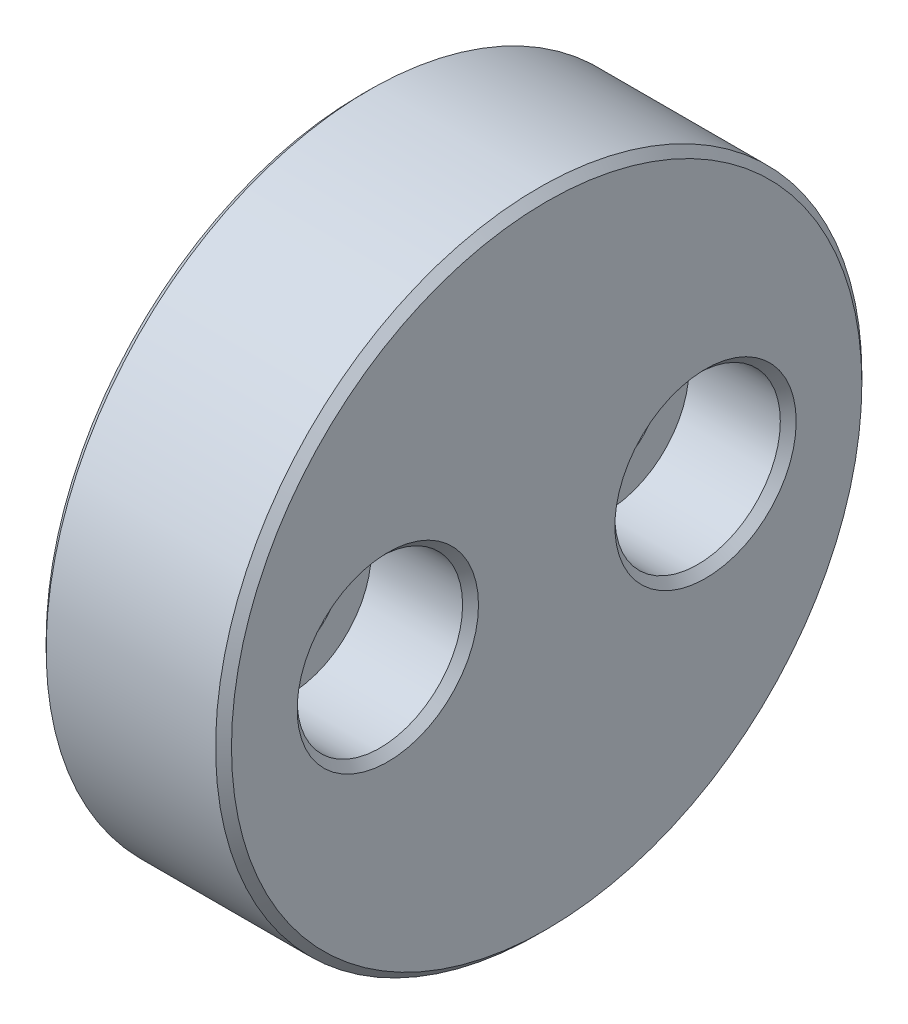
ISO-10303-21;
HEADER;
FILE_DESCRIPTION(('STEP AP214'),'2;1');
FILE_NAME('part.step','',(''),(''),'','','');
FILE_SCHEMA(('AUTOMOTIVE_DESIGN { 1 0 10303 214 1 1 1 1 }'));
ENDSEC;
DATA;
#1=APPLICATION_CONTEXT('core data for automotive mechanical design processes');
#2=APPLICATION_PROTOCOL_DEFINITION('international standard','automotive_design',2000,#1);
#3=PRODUCT_CONTEXT('',#1,'mechanical');
#4=PRODUCT('Part','Part','',(#3));
#5=PRODUCT_RELATED_PRODUCT_CATEGORY('part','',(#4));
#6=PRODUCT_DEFINITION_FORMATION('','',#4);
#7=PRODUCT_DEFINITION_CONTEXT('part definition',#1,'design');
#8=PRODUCT_DEFINITION('design','',#6,#7);
#9=PRODUCT_DEFINITION_SHAPE('','',#8);
#10=(LENGTH_UNIT() NAMED_UNIT(*) SI_UNIT(.MILLI.,.METRE.));
#11=(NAMED_UNIT(*) PLANE_ANGLE_UNIT() SI_UNIT($,.RADIAN.));
#12=(NAMED_UNIT(*) SI_UNIT($,.STERADIAN.) SOLID_ANGLE_UNIT());
#13=UNCERTAINTY_MEASURE_WITH_UNIT(LENGTH_MEASURE(1.E-05),#10,'distance_accuracy_value','');
#14=(GEOMETRIC_REPRESENTATION_CONTEXT(3) GLOBAL_UNCERTAINTY_ASSIGNED_CONTEXT((#13)) GLOBAL_UNIT_ASSIGNED_CONTEXT((#10,
#11,#12)) REPRESENTATION_CONTEXT('',''));
#15=CARTESIAN_POINT('',(0.,0.,0.));
#16=DIRECTION('',(0.,0.,1.));
#17=DIRECTION('',(1.,0.,0.));
#18=AXIS2_PLACEMENT_3D('',#15,#16,#17);
#19=CARTESIAN_POINT('',(17.78,0.,0.));
#20=DIRECTION('',(-1.,0.,0.));
#21=DIRECTION('',(0.,0.,1.));
#22=AXIS2_PLACEMENT_3D('',#19,#20,#21);
#23=CYLINDRICAL_SURFACE('',#22,31.);
#24=CARTESIAN_POINT('',(0.762000000000002,0.,0.));
#25=DIRECTION('',(1.,0.,0.));
#26=DIRECTION('',(0.,0.,-1.));
#27=AXIS2_PLACEMENT_3D('',#24,#25,#26);
#28=CIRCLE('',#27,31.);
#29=CARTESIAN_POINT('',(0.762000000000002,0.,-31.));
#30=VERTEX_POINT('',#29);
#31=EDGE_CURVE('E57',#30,#30,#28,.T.);
#32=ORIENTED_EDGE('',*,*,#31,.T.);
#33=EDGE_LOOP('',(#32));
#34=FACE_BOUND('',#33,.T.);
#35=CARTESIAN_POINT('',(17.018,0.,0.));
#36=DIRECTION('',(1.,0.,0.));
#37=DIRECTION('',(0.,0.,-1.));
#38=AXIS2_PLACEMENT_3D('',#35,#36,#37);
#39=CIRCLE('',#38,31.);
#40=CARTESIAN_POINT('',(17.018,0.,-31.));
#41=VERTEX_POINT('',#40);
#42=EDGE_CURVE('E60',#41,#41,#39,.F.);
#43=ORIENTED_EDGE('',*,*,#42,.T.);
#44=EDGE_LOOP('',(#43));
#45=FACE_BOUND('',#44,.T.);
#46=ADVANCED_FACE('F31',(#34,#45),#23,.T.);
#47=CARTESIAN_POINT('',(17.78,0.,0.));
#48=DIRECTION('',(1.,0.,0.));
#49=DIRECTION('',(0.,0.,-1.));
#50=AXIS2_PLACEMENT_3D('',#47,#48,#49);
#51=PLANE('',#50);
#52=CARTESIAN_POINT('',(17.78,0.,-15.24));
#53=DIRECTION('',(1.,0.,0.));
#54=DIRECTION('',(0.,0.,-1.));
#55=AXIS2_PLACEMENT_3D('',#52,#53,#54);
#56=CIRCLE('',#55,8.6995);
#57=CARTESIAN_POINT('',(17.78,0.,-23.9395));
#58=VERTEX_POINT('',#57);
#59=EDGE_CURVE('E38',#58,#58,#56,.F.);
#60=ORIENTED_EDGE('',*,*,#59,.T.);
#61=EDGE_LOOP('',(#60));
#62=FACE_BOUND('',#61,.T.);
#63=CARTESIAN_POINT('',(17.78,0.,15.24));
#64=DIRECTION('',(1.,0.,0.));
#65=DIRECTION('',(0.,0.,-1.));
#66=AXIS2_PLACEMENT_3D('',#63,#64,#65);
#67=CIRCLE('',#66,8.6995);
#68=CARTESIAN_POINT('',(17.78,0.,6.5405));
#69=VERTEX_POINT('',#68);
#70=EDGE_CURVE('E42',#69,#69,#67,.F.);
#71=ORIENTED_EDGE('',*,*,#70,.T.);
#72=EDGE_LOOP('',(#71));
#73=FACE_BOUND('',#72,.T.);
#74=CARTESIAN_POINT('',(17.78,0.,0.));
#75=DIRECTION('',(1.,0.,0.));
#76=DIRECTION('',(0.,0.,-1.));
#77=AXIS2_PLACEMENT_3D('',#74,#75,#76);
#78=CIRCLE('',#77,30.238);
#79=CARTESIAN_POINT('',(17.78,0.,-30.238));
#80=VERTEX_POINT('',#79);
#81=EDGE_CURVE('E46',#80,#80,#78,.T.);
#82=ORIENTED_EDGE('',*,*,#81,.T.);
#83=EDGE_LOOP('',(#82));
#84=FACE_BOUND('',#83,.T.);
#85=ADVANCED_FACE('F99',(#62,#73,#84),#51,.T.);
#86=CARTESIAN_POINT('',(0.,0.,0.));
#87=DIRECTION('',(1.,0.,0.));
#88=DIRECTION('',(0.,0.,-1.));
#89=AXIS2_PLACEMENT_3D('',#86,#87,#88);
#90=PLANE('',#89);
#91=CARTESIAN_POINT('',(0.,0.,0.));
#92=DIRECTION('',(1.,0.,0.));
#93=DIRECTION('',(0.,0.,-1.));
#94=AXIS2_PLACEMENT_3D('',#91,#92,#93);
#95=CIRCLE('',#94,30.238);
#96=CARTESIAN_POINT('',(0.,0.,-30.238));
#97=VERTEX_POINT('',#96);
#98=EDGE_CURVE('E54',#97,#97,#95,.F.);
#99=ORIENTED_EDGE('',*,*,#98,.T.);
#100=EDGE_LOOP('',(#99));
#101=FACE_BOUND('',#100,.T.);
#102=CARTESIAN_POINT('',(0.,0.,15.24));
#103=DIRECTION('',(1.,0.,0.));
#104=DIRECTION('',(0.,0.,-1.));
#105=AXIS2_PLACEMENT_3D('',#102,#103,#104);
#106=CIRCLE('',#105,4.90219999999999);
#107=CARTESIAN_POINT('',(0.,0.,10.3378));
#108=VERTEX_POINT('',#107);
#109=EDGE_CURVE('E64',#108,#108,#106,.T.);
#110=ORIENTED_EDGE('',*,*,#109,.T.);
#111=EDGE_LOOP('',(#110));
#112=FACE_BOUND('',#111,.T.);
#113=CARTESIAN_POINT('',(0.,0.,-15.24));
#114=DIRECTION('',(1.,0.,0.));
#115=DIRECTION('',(0.,0.,-1.));
#116=AXIS2_PLACEMENT_3D('',#113,#114,#115);
#117=CIRCLE('',#116,4.90219999999999);
#118=CARTESIAN_POINT('',(0.,0.,-20.1422));
#119=VERTEX_POINT('',#118);
#120=EDGE_CURVE('E63',#119,#119,#117,.T.);
#121=ORIENTED_EDGE('',*,*,#120,.T.);
#122=EDGE_LOOP('',(#121));
#123=FACE_BOUND('',#122,.T.);
#124=ADVANCED_FACE('F105',(#101,#112,#123),#90,.F.);
#125=CARTESIAN_POINT('',(17.78,0.,-15.24));
#126=DIRECTION('',(1.,0.,0.));
#127=DIRECTION('',(0.,0.,-1.));
#128=AXIS2_PLACEMENT_3D('',#125,#126,#127);
#129=CYLINDRICAL_SURFACE('',#128,4.90219999999999);
#130=CARTESIAN_POINT('',(8.255,0.,-15.24));
#131=DIRECTION('',(1.,0.,0.));
#132=DIRECTION('',(0.,0.,-1.));
#133=AXIS2_PLACEMENT_3D('',#130,#131,#132);
#134=CIRCLE('',#133,4.9022);
#135=CARTESIAN_POINT('',(8.255,0.,-20.1422));
#136=VERTEX_POINT('',#135);
#137=EDGE_CURVE('E71',#136,#136,#134,.T.);
#138=ORIENTED_EDGE('',*,*,#137,.T.);
#139=EDGE_LOOP('',(#138));
#140=FACE_BOUND('',#139,.T.);
#141=ORIENTED_EDGE('',*,*,#120,.F.);
#142=EDGE_LOOP('',(#141));
#143=FACE_BOUND('',#142,.T.);
#144=ADVANCED_FACE('F173',(#140,#143),#129,.F.);
#145=CARTESIAN_POINT('',(8.255,4.9022,-15.24));
#146=DIRECTION('',(-1.,0.,0.));
#147=DIRECTION('',(0.,0.,1.));
#148=AXIS2_PLACEMENT_3D('',#145,#146,#147);
#149=PLANE('',#148);
#150=ORIENTED_EDGE('',*,*,#137,.F.);
#151=EDGE_LOOP('',(#150));
#152=FACE_BOUND('',#151,.T.);
#153=CARTESIAN_POINT('',(8.255,0.,-15.24));
#154=DIRECTION('',(1.,0.,0.));
#155=DIRECTION('',(0.,0.,-1.));
#156=AXIS2_PLACEMENT_3D('',#153,#154,#155);
#157=CIRCLE('',#156,7.9375);
#158=CARTESIAN_POINT('',(8.255,0.,-23.1775));
#159=VERTEX_POINT('',#158);
#160=EDGE_CURVE('E67',#159,#159,#157,.T.);
#161=ORIENTED_EDGE('',*,*,#160,.T.);
#162=EDGE_LOOP('',(#161));
#163=FACE_BOUND('',#162,.T.);
#164=ADVANCED_FACE('F159',(#152,#163),#149,.F.);
#165=CARTESIAN_POINT('',(17.78,0.,-15.24));
#166=DIRECTION('',(1.,0.,0.));
#167=DIRECTION('',(0.,0.,-1.));
#168=AXIS2_PLACEMENT_3D('',#165,#166,#167);
#169=CYLINDRICAL_SURFACE('',#168,7.9375);
#170=CARTESIAN_POINT('',(17.018,0.,-15.24));
#171=DIRECTION('',(1.,0.,0.));
#172=DIRECTION('',(0.,0.,-1.));
#173=AXIS2_PLACEMENT_3D('',#170,#171,#172);
#174=CIRCLE('',#173,7.9375);
#175=CARTESIAN_POINT('',(17.018,0.,-23.1775));
#176=VERTEX_POINT('',#175);
#177=EDGE_CURVE('E51',#176,#176,#174,.T.);
#178=ORIENTED_EDGE('',*,*,#177,.T.);
#179=EDGE_LOOP('',(#178));
#180=FACE_BOUND('',#179,.T.);
#181=ORIENTED_EDGE('',*,*,#160,.F.);
#182=EDGE_LOOP('',(#181));
#183=FACE_BOUND('',#182,.T.);
#184=ADVANCED_FACE('F154',(#180,#183),#169,.F.);
#185=CARTESIAN_POINT('',(17.78,0.,15.24));
#186=DIRECTION('',(1.,0.,0.));
#187=DIRECTION('',(0.,0.,-1.));
#188=AXIS2_PLACEMENT_3D('',#185,#186,#187);
#189=CYLINDRICAL_SURFACE('',#188,4.90219999999999);
#190=CARTESIAN_POINT('',(8.255,0.,15.24));
#191=DIRECTION('',(1.,0.,0.));
#192=DIRECTION('',(0.,0.,-1.));
#193=AXIS2_PLACEMENT_3D('',#190,#191,#192);
#194=CIRCLE('',#193,4.9022);
#195=CARTESIAN_POINT('',(8.255,0.,10.3378));
#196=VERTEX_POINT('',#195);
#197=EDGE_CURVE('E68',#196,#196,#194,.T.);
#198=ORIENTED_EDGE('',*,*,#197,.T.);
#199=EDGE_LOOP('',(#198));
#200=FACE_BOUND('',#199,.T.);
#201=ORIENTED_EDGE('',*,*,#109,.F.);
#202=EDGE_LOOP('',(#201));
#203=FACE_BOUND('',#202,.T.);
#204=ADVANCED_FACE('F95',(#200,#203),#189,.F.);
#205=CARTESIAN_POINT('',(8.255,4.9022,15.24));
#206=DIRECTION('',(-1.,0.,0.));
#207=DIRECTION('',(0.,0.,1.));
#208=AXIS2_PLACEMENT_3D('',#205,#206,#207);
#209=PLANE('',#208);
#210=ORIENTED_EDGE('',*,*,#197,.F.);
#211=EDGE_LOOP('',(#210));
#212=FACE_BOUND('',#211,.T.);
#213=CARTESIAN_POINT('',(8.255,0.,15.24));
#214=DIRECTION('',(1.,0.,0.));
#215=DIRECTION('',(0.,0.,-1.));
#216=AXIS2_PLACEMENT_3D('',#213,#214,#215);
#217=CIRCLE('',#216,7.9375);
#218=CARTESIAN_POINT('',(8.255,0.,7.3025));
#219=VERTEX_POINT('',#218);
#220=EDGE_CURVE('E78',#219,#219,#217,.T.);
#221=ORIENTED_EDGE('',*,*,#220,.T.);
#222=EDGE_LOOP('',(#221));
#223=FACE_BOUND('',#222,.T.);
#224=ADVANCED_FACE('F82',(#212,#223),#209,.F.);
#225=CARTESIAN_POINT('',(17.78,0.,15.24));
#226=DIRECTION('',(1.,0.,0.));
#227=DIRECTION('',(0.,0.,-1.));
#228=AXIS2_PLACEMENT_3D('',#225,#226,#227);
#229=CYLINDRICAL_SURFACE('',#228,7.9375);
#230=CARTESIAN_POINT('',(17.018,0.,15.24));
#231=DIRECTION('',(1.,0.,0.));
#232=DIRECTION('',(0.,0.,-1.));
#233=AXIS2_PLACEMENT_3D('',#230,#231,#232);
#234=CIRCLE('',#233,7.9375);
#235=CARTESIAN_POINT('',(17.018,0.,7.3025));
#236=VERTEX_POINT('',#235);
#237=EDGE_CURVE('E10',#236,#236,#234,.T.);
#238=ORIENTED_EDGE('',*,*,#237,.T.);
#239=EDGE_LOOP('',(#238));
#240=FACE_BOUND('',#239,.T.);
#241=ORIENTED_EDGE('',*,*,#220,.F.);
#242=EDGE_LOOP('',(#241));
#243=FACE_BOUND('',#242,.T.);
#244=ADVANCED_FACE('F84',(#240,#243),#229,.F.);
#245=CARTESIAN_POINT('',(0.762000000000002,0.,0.));
#246=DIRECTION('',(1.,0.,0.));
#247=DIRECTION('',(0.,0.,-1.));
#248=AXIS2_PLACEMENT_3D('',#245,#246,#247);
#249=CONICAL_SURFACE('',#248,31.,0.785398163397451);
#250=ORIENTED_EDGE('',*,*,#98,.F.);
#251=EDGE_LOOP('',(#250));
#252=FACE_BOUND('',#251,.T.);
#253=ORIENTED_EDGE('',*,*,#31,.F.);
#254=EDGE_LOOP('',(#253));
#255=FACE_BOUND('',#254,.T.);
#256=ADVANCED_FACE('F86',(#252,#255),#249,.T.);
#257=CARTESIAN_POINT('',(17.018,0.,-15.24));
#258=DIRECTION('',(1.,0.,0.));
#259=DIRECTION('',(0.,0.,-1.));
#260=AXIS2_PLACEMENT_3D('',#257,#258,#259);
#261=CONICAL_SURFACE('',#260,7.9375,0.785398163397455);
#262=CARTESIAN_POINT('',(17.78,0.,-23.9395));
#263=CARTESIAN_POINT('',(17.7720625,0.,-23.9315625));
#264=CARTESIAN_POINT('',(17.764125,0.,-23.923625));
#265=CARTESIAN_POINT('',(17.74825,0.,-23.90775));
#266=CARTESIAN_POINT('',(17.7403125,0.,-23.8998125));
#267=CARTESIAN_POINT('',(17.7244375,0.,-23.8839375));
#268=CARTESIAN_POINT('',(17.7165,0.,-23.876));
#269=CARTESIAN_POINT('',(17.700625,0.,-23.860125));
#270=CARTESIAN_POINT('',(17.6926875,0.,-23.8521875));
#271=CARTESIAN_POINT('',(17.6768125,0.,-23.8363125));
#272=CARTESIAN_POINT('',(17.668875,0.,-23.828375));
#273=CARTESIAN_POINT('',(17.653,0.,-23.8125));
#274=CARTESIAN_POINT('',(17.6450625,0.,-23.8045625));
#275=CARTESIAN_POINT('',(17.6291875,0.,-23.7886875));
#276=CARTESIAN_POINT('',(17.62125,0.,-23.78075));
#277=CARTESIAN_POINT('',(17.605375,0.,-23.764875));
#278=CARTESIAN_POINT('',(17.5974375,0.,-23.7569375));
#279=CARTESIAN_POINT('',(17.5815625,0.,-23.7410625));
#280=CARTESIAN_POINT('',(17.573625,0.,-23.733125));
#281=CARTESIAN_POINT('',(17.55775,0.,-23.71725));
#282=CARTESIAN_POINT('',(17.5498125,0.,-23.7093125));
#283=CARTESIAN_POINT('',(17.5339375,0.,-23.6934375));
#284=CARTESIAN_POINT('',(17.526,0.,-23.6855));
#285=CARTESIAN_POINT('',(17.510125,0.,-23.669625));
#286=CARTESIAN_POINT('',(17.5021875,0.,-23.6616875));
#287=CARTESIAN_POINT('',(17.4863125,0.,-23.6458125));
#288=CARTESIAN_POINT('',(17.478375,0.,-23.637875));
#289=CARTESIAN_POINT('',(17.4625,0.,-23.622));
#290=CARTESIAN_POINT('',(17.4545625,0.,-23.6140625));
#291=CARTESIAN_POINT('',(17.4386875,0.,-23.5981875));
#292=CARTESIAN_POINT('',(17.43075,0.,-23.59025));
#293=CARTESIAN_POINT('',(17.414875,0.,-23.574375));
#294=CARTESIAN_POINT('',(17.4069375,0.,-23.5664375));
#295=CARTESIAN_POINT('',(17.3910625,0.,-23.5505625));
#296=CARTESIAN_POINT('',(17.383125,0.,-23.542625));
#297=CARTESIAN_POINT('',(17.36725,0.,-23.52675));
#298=CARTESIAN_POINT('',(17.3593125,0.,-23.5188125));
#299=CARTESIAN_POINT('',(17.3434375,0.,-23.5029375));
#300=CARTESIAN_POINT('',(17.3355,0.,-23.495));
#301=CARTESIAN_POINT('',(17.319625,0.,-23.479125));
#302=CARTESIAN_POINT('',(17.3116875,0.,-23.4711875));
#303=CARTESIAN_POINT('',(17.2958125,0.,-23.4553125));
#304=CARTESIAN_POINT('',(17.287875,0.,-23.447375));
#305=CARTESIAN_POINT('',(17.272,0.,-23.4315));
#306=CARTESIAN_POINT('',(17.2640625,0.,-23.4235625));
#307=CARTESIAN_POINT('',(17.2481875,0.,-23.4076875));
#308=CARTESIAN_POINT('',(17.24025,0.,-23.39975));
#309=CARTESIAN_POINT('',(17.224375,0.,-23.383875));
#310=CARTESIAN_POINT('',(17.2164375,0.,-23.3759375));
#311=CARTESIAN_POINT('',(17.2005625,0.,-23.3600625));
#312=CARTESIAN_POINT('',(17.192625,0.,-23.352125));
#313=CARTESIAN_POINT('',(17.17675,0.,-23.33625));
#314=CARTESIAN_POINT('',(17.1688125,0.,-23.3283125));
#315=CARTESIAN_POINT('',(17.1529375,0.,-23.3124375));
#316=CARTESIAN_POINT('',(17.145,0.,-23.3045));
#317=CARTESIAN_POINT('',(17.129125,0.,-23.288625));
#318=CARTESIAN_POINT('',(17.1211875,0.,-23.2806875));
#319=CARTESIAN_POINT('',(17.1053125,0.,-23.2648125));
#320=CARTESIAN_POINT('',(17.097375,0.,-23.256875));
#321=CARTESIAN_POINT('',(17.0815,0.,-23.241));
#322=CARTESIAN_POINT('',(17.0735625,0.,-23.2330625));
#323=CARTESIAN_POINT('',(17.0576875,0.,-23.2171875));
#324=CARTESIAN_POINT('',(17.04975,0.,-23.20925));
#325=CARTESIAN_POINT('',(17.033875,0.,-23.193375));
#326=CARTESIAN_POINT('',(17.0259375,0.,-23.1854375));
#327=CARTESIAN_POINT('',(17.018,0.,-23.1775));
#328=B_SPLINE_CURVE_WITH_KNOTS('',3,(#262,#263,#264,#265,#266,#267,#268,#269,#270,#271,#272,
#273,#274,#275,#276,#277,#278,#279,#280,#281,#282,#283,#284,#285,#286,#287,#288,#289,#290,#291,
#292,#293,#294,#295,#296,#297,#298,#299,#300,#301,#302,#303,#304,#305,#306,#307,#308,#309,#310,
#311,#312,#313,#314,#315,#316,#317,#318,#319,#320,#321,#322,#323,#324,#325,#326,#327),
.UNSPECIFIED.,.F.,.F.,(4,2,2,2,2,2,2,2,2,2,2,2,2,2,2,2,2,2,2,2,2,2,2,2,2,2,2,2,2,2,2,2,4),(0.,
0.0336759604540062,0.0673519209080173,0.101027881362026,0.134703841816035,0.168379802270043,
0.202055762724054,0.235731723178061,0.269407683632072,0.30308364408608,0.336759604540089,
0.370435564994098,0.404111525448109,0.437787485902115,0.471463446356124,0.505139406810135,
0.538815367264143,0.572491327718152,0.606167288172161,0.639843248626172,0.673519209080178,
0.707195169534189,0.740871129988198,0.774547090442206,0.808223050896215,0.841899011350226,
0.875574971804232,0.909250932258243,0.942926892712252,0.976602853166261,1.01027881362027,
1.04395477407428,1.07763073452829),.UNSPECIFIED.);
#329=EDGE_CURVE('BSEAM92',#58,#176,#328,.T.);
#330=ORIENTED_EDGE('',*,*,#59,.F.);
#331=ORIENTED_EDGE('',*,*,#177,.F.);
#332=ORIENTED_EDGE('',*,*,#329,.T.);
#333=ORIENTED_EDGE('',*,*,#329,.F.);
#334=EDGE_LOOP('',(#330,#332,#331,#333));
#335=FACE_BOUND('',#334,.T.);
#336=ADVANCED_FACE('F92',(#335),#261,.F.);
#337=CARTESIAN_POINT('',(17.018,0.,15.24));
#338=DIRECTION('',(1.,0.,0.));
#339=DIRECTION('',(0.,0.,-1.));
#340=AXIS2_PLACEMENT_3D('',#337,#338,#339);
#341=CONICAL_SURFACE('',#340,7.9375,0.785398163397454);
#342=CARTESIAN_POINT('',(17.78,0.,6.5405));
#343=CARTESIAN_POINT('',(17.7720625,0.,6.5484375));
#344=CARTESIAN_POINT('',(17.764125,0.,6.556375));
#345=CARTESIAN_POINT('',(17.74825,0.,6.57225));
#346=CARTESIAN_POINT('',(17.7403125,0.,6.5801875));
#347=CARTESIAN_POINT('',(17.7244375,0.,6.5960625));
#348=CARTESIAN_POINT('',(17.7165,0.,6.604));
#349=CARTESIAN_POINT('',(17.700625,0.,6.619875));
#350=CARTESIAN_POINT('',(17.6926875,0.,6.6278125));
#351=CARTESIAN_POINT('',(17.6768125,0.,6.6436875));
#352=CARTESIAN_POINT('',(17.668875,0.,6.651625));
#353=CARTESIAN_POINT('',(17.653,0.,6.6675));
#354=CARTESIAN_POINT('',(17.6450625,0.,6.6754375));
#355=CARTESIAN_POINT('',(17.6291875,0.,6.6913125));
#356=CARTESIAN_POINT('',(17.62125,0.,6.69925));
#357=CARTESIAN_POINT('',(17.605375,0.,6.715125));
#358=CARTESIAN_POINT('',(17.5974375,0.,6.7230625));
#359=CARTESIAN_POINT('',(17.5815625,0.,6.7389375));
#360=CARTESIAN_POINT('',(17.573625,0.,6.746875));
#361=CARTESIAN_POINT('',(17.55775,0.,6.76275));
#362=CARTESIAN_POINT('',(17.5498125,0.,6.7706875));
#363=CARTESIAN_POINT('',(17.5339375,0.,6.7865625));
#364=CARTESIAN_POINT('',(17.526,0.,6.7945));
#365=CARTESIAN_POINT('',(17.510125,0.,6.810375));
#366=CARTESIAN_POINT('',(17.5021875,0.,6.8183125));
#367=CARTESIAN_POINT('',(17.4863125,0.,6.8341875));
#368=CARTESIAN_POINT('',(17.478375,0.,6.842125));
#369=CARTESIAN_POINT('',(17.4625,0.,6.858));
#370=CARTESIAN_POINT('',(17.4545625,0.,6.8659375));
#371=CARTESIAN_POINT('',(17.4386875,0.,6.8818125));
#372=CARTESIAN_POINT('',(17.43075,0.,6.88975));
#373=CARTESIAN_POINT('',(17.414875,0.,6.905625));
#374=CARTESIAN_POINT('',(17.4069375,0.,6.9135625));
#375=CARTESIAN_POINT('',(17.3910625,0.,6.9294375));
#376=CARTESIAN_POINT('',(17.383125,0.,6.937375));
#377=CARTESIAN_POINT('',(17.36725,0.,6.95325));
#378=CARTESIAN_POINT('',(17.3593125,0.,6.9611875));
#379=CARTESIAN_POINT('',(17.3434375,0.,6.9770625));
#380=CARTESIAN_POINT('',(17.3355,0.,6.985));
#381=CARTESIAN_POINT('',(17.319625,0.,7.000875));
#382=CARTESIAN_POINT('',(17.3116875,0.,7.0088125));
#383=CARTESIAN_POINT('',(17.2958125,0.,7.0246875));
#384=CARTESIAN_POINT('',(17.287875,0.,7.032625));
#385=CARTESIAN_POINT('',(17.272,0.,7.0485));
#386=CARTESIAN_POINT('',(17.2640625,0.,7.0564375));
#387=CARTESIAN_POINT('',(17.2481875,0.,7.0723125));
#388=CARTESIAN_POINT('',(17.24025,0.,7.08025));
#389=CARTESIAN_POINT('',(17.224375,0.,7.096125));
#390=CARTESIAN_POINT('',(17.2164375,0.,7.1040625));
#391=CARTESIAN_POINT('',(17.2005625,0.,7.1199375));
#392=CARTESIAN_POINT('',(17.192625,0.,7.127875));
#393=CARTESIAN_POINT('',(17.17675,0.,7.14375));
#394=CARTESIAN_POINT('',(17.1688125,0.,7.1516875));
#395=CARTESIAN_POINT('',(17.1529375,0.,7.1675625));
#396=CARTESIAN_POINT('',(17.145,0.,7.1755));
#397=CARTESIAN_POINT('',(17.129125,0.,7.191375));
#398=CARTESIAN_POINT('',(17.1211875,0.,7.1993125));
#399=CARTESIAN_POINT('',(17.1053125,0.,7.2151875));
#400=CARTESIAN_POINT('',(17.097375,0.,7.223125));
#401=CARTESIAN_POINT('',(17.0815,0.,7.239));
#402=CARTESIAN_POINT('',(17.0735625,0.,7.2469375));
#403=CARTESIAN_POINT('',(17.0576875,0.,7.2628125));
#404=CARTESIAN_POINT('',(17.04975,0.,7.27075));
#405=CARTESIAN_POINT('',(17.033875,0.,7.286625));
#406=CARTESIAN_POINT('',(17.0259375,0.,7.2945625));
#407=CARTESIAN_POINT('',(17.018,0.,7.3025));
#408=B_SPLINE_CURVE_WITH_KNOTS('',3,(#342,#343,#344,#345,#346,#347,#348,#349,#350,#351,#352,
#353,#354,#355,#356,#357,#358,#359,#360,#361,#362,#363,#364,#365,#366,#367,#368,#369,#370,#371,
#372,#373,#374,#375,#376,#377,#378,#379,#380,#381,#382,#383,#384,#385,#386,#387,#388,#389,#390,
#391,#392,#393,#394,#395,#396,#397,#398,#399,#400,#401,#402,#403,#404,#405,#406,#407),
.UNSPECIFIED.,.F.,.F.,(4,2,2,2,2,2,2,2,2,2,2,2,2,2,2,2,2,2,2,2,2,2,2,2,2,2,2,2,2,2,2,2,4),(0.,
0.0336759604540074,0.0673519209080173,0.101027881362026,0.134703841816036,0.168379802270043,
0.202055762724053,0.235731723178062,0.269407683632072,0.303083644086079,0.336759604540089,
0.370435564994097,0.404111525448108,0.437787485902115,0.471463446356125,0.505139406810132,
0.538815367264143,0.572491327718153,0.606167288172161,0.639843248626171,0.673519209080178,
0.707195169534189,0.740871129988196,0.774547090442206,0.808223050896214,0.841899011350224,
0.875574971804232,0.909250932258242,0.94292689271225,0.976602853166259,1.01027881362027,
1.04395477407428,1.07763073452829),.UNSPECIFIED.);
#409=EDGE_CURVE('BSEAM111',#69,#236,#408,.T.);
#410=ORIENTED_EDGE('',*,*,#70,.F.);
#411=ORIENTED_EDGE('',*,*,#237,.F.);
#412=ORIENTED_EDGE('',*,*,#409,.T.);
#413=ORIENTED_EDGE('',*,*,#409,.F.);
#414=EDGE_LOOP('',(#410,#412,#411,#413));
#415=FACE_BOUND('',#414,.T.);
#416=ADVANCED_FACE('F111',(#415),#341,.F.);
#417=CARTESIAN_POINT('',(17.78,0.,0.));
#418=DIRECTION('',(-1.,0.,0.));
#419=DIRECTION('',(0.,0.,1.));
#420=AXIS2_PLACEMENT_3D('',#417,#418,#419);
#421=CONICAL_SURFACE('',#420,30.238,0.785398163397442);
#422=ORIENTED_EDGE('',*,*,#42,.F.);
#423=EDGE_LOOP('',(#422));
#424=FACE_BOUND('',#423,.T.);
#425=ORIENTED_EDGE('',*,*,#81,.F.);
#426=EDGE_LOOP('',(#425));
#427=FACE_BOUND('',#426,.T.);
#428=ADVANCED_FACE('F33',(#424,#427),#421,.T.);
#429=CLOSED_SHELL('',(#46,#85,#124,#144,#164,#184,#204,#224,#244,#256,#336,#416,#428));
#430=MANIFOLD_SOLID_BREP('B2',#429);
#431=ADVANCED_BREP_SHAPE_REPRESENTATION('',(#18,#430),#14);
#432=SHAPE_DEFINITION_REPRESENTATION(#9,#431);
ENDSEC;
END-ISO-10303-21;
